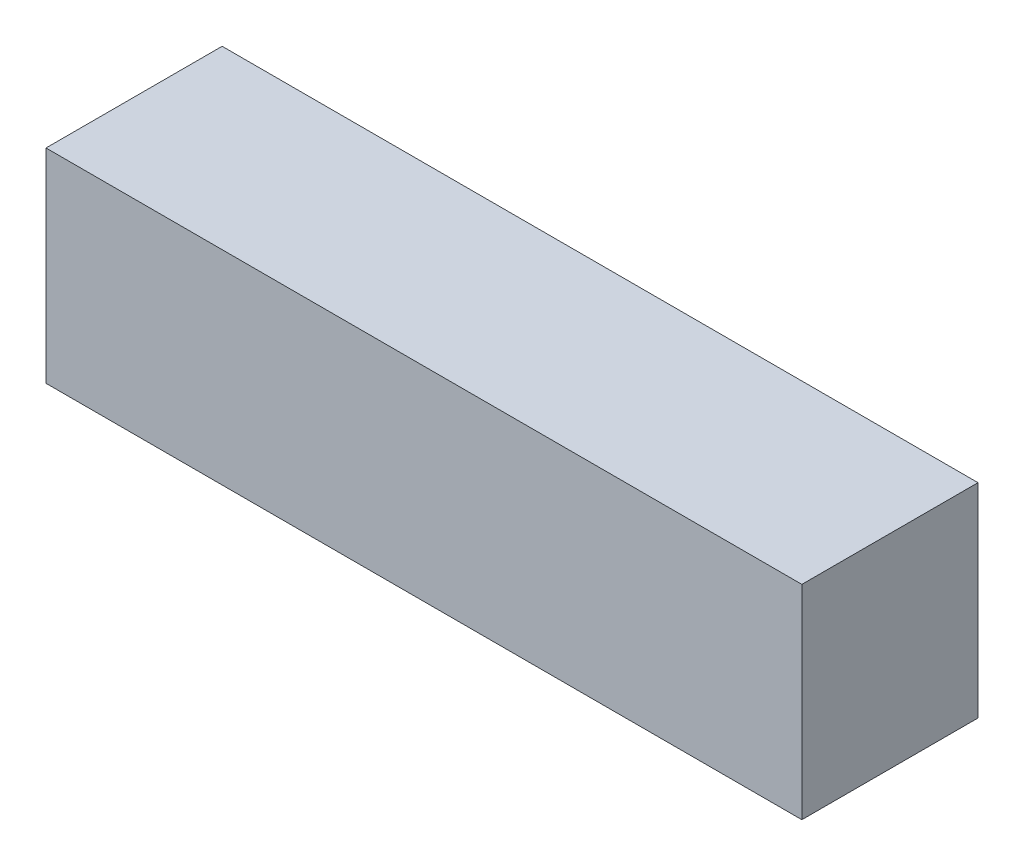
ISO-10303-21;
HEADER;
FILE_DESCRIPTION(('STEP AP214'),'2;1');
FILE_NAME('part.step','',(''),(''),'','','');
FILE_SCHEMA(('AUTOMOTIVE_DESIGN { 1 0 10303 214 1 1 1 1 }'));
ENDSEC;
DATA;
#1=APPLICATION_CONTEXT('core data for automotive mechanical design processes');
#2=APPLICATION_PROTOCOL_DEFINITION('international standard','automotive_design',2000,#1);
#3=PRODUCT_CONTEXT('',#1,'mechanical');
#4=PRODUCT('Part','Part','',(#3));
#5=PRODUCT_RELATED_PRODUCT_CATEGORY('part','',(#4));
#6=PRODUCT_DEFINITION_FORMATION('','',#4);
#7=PRODUCT_DEFINITION_CONTEXT('part definition',#1,'design');
#8=PRODUCT_DEFINITION('design','',#6,#7);
#9=PRODUCT_DEFINITION_SHAPE('','',#8);
#10=(LENGTH_UNIT() NAMED_UNIT(*) SI_UNIT(.MILLI.,.METRE.));
#11=(NAMED_UNIT(*) PLANE_ANGLE_UNIT() SI_UNIT($,.RADIAN.));
#12=(NAMED_UNIT(*) SI_UNIT($,.STERADIAN.) SOLID_ANGLE_UNIT());
#13=UNCERTAINTY_MEASURE_WITH_UNIT(LENGTH_MEASURE(1.E-05),#10,'distance_accuracy_value','');
#14=(GEOMETRIC_REPRESENTATION_CONTEXT(3) GLOBAL_UNCERTAINTY_ASSIGNED_CONTEXT((#13)) GLOBAL_UNIT_ASSIGNED_CONTEXT((#10,
#11,#12)) REPRESENTATION_CONTEXT('',''));
#15=CARTESIAN_POINT('',(0.,0.,0.));
#16=DIRECTION('',(0.,0.,1.));
#17=DIRECTION('',(1.,0.,0.));
#18=AXIS2_PLACEMENT_3D('',#15,#16,#17);
#19=CARTESIAN_POINT('',(0.,0.,24.2316));
#20=DIRECTION('',(1.,0.,0.));
#21=DIRECTION('',(0.,1.,0.));
#22=AXIS2_PLACEMENT_3D('',#19,#20,#21);
#23=PLANE('',#22);
#24=DIRECTION('',(0.,-1.,0.));
#25=VECTOR('',#24,1.);
#26=CARTESIAN_POINT('',(0.,0.,0.));
#27=LINE('',#26,#25);
#28=CARTESIAN_POINT('',(0.,28.0416,0.));
#29=VERTEX_POINT('',#28);
#30=CARTESIAN_POINT('',(0.,0.,0.));
#31=VERTEX_POINT('',#30);
#32=EDGE_CURVE('E96',#29,#31,#27,.T.);
#33=ORIENTED_EDGE('',*,*,#32,.T.);
#34=DIRECTION('',(0.,0.,-1.));
#35=VECTOR('',#34,1.);
#36=CARTESIAN_POINT('',(0.,0.,24.2316));
#37=LINE('',#36,#35);
#38=CARTESIAN_POINT('',(0.,0.,24.2316));
#39=VERTEX_POINT('',#38);
#40=EDGE_CURVE('E11',#39,#31,#37,.T.);
#41=ORIENTED_EDGE('',*,*,#40,.F.);
#42=DIRECTION('',(0.,-1.,0.));
#43=VECTOR('',#42,1.);
#44=CARTESIAN_POINT('',(0.,0.,24.2316));
#45=LINE('',#44,#43);
#46=CARTESIAN_POINT('',(0.,28.0416,24.2316));
#47=VERTEX_POINT('',#46);
#48=EDGE_CURVE('E84',#47,#39,#45,.T.);
#49=ORIENTED_EDGE('',*,*,#48,.F.);
#50=DIRECTION('',(0.,0.,-1.));
#51=VECTOR('',#50,1.);
#52=CARTESIAN_POINT('',(0.,28.0416,24.2316));
#53=LINE('',#52,#51);
#54=EDGE_CURVE('E92',#47,#29,#53,.T.);
#55=ORIENTED_EDGE('',*,*,#54,.T.);
#56=EDGE_LOOP('',(#33,#41,#49,#55));
#57=FACE_BOUND('',#56,.T.);
#58=ADVANCED_FACE('F33',(#57),#23,.F.);
#59=CARTESIAN_POINT('',(0.,0.,24.2316));
#60=DIRECTION('',(0.,1.,0.));
#61=DIRECTION('',(0.,0.,1.));
#62=AXIS2_PLACEMENT_3D('',#59,#60,#61);
#63=PLANE('',#62);
#64=DIRECTION('',(1.,0.,0.));
#65=VECTOR('',#64,1.);
#66=CARTESIAN_POINT('',(0.,0.,0.));
#67=LINE('',#66,#65);
#68=CARTESIAN_POINT('',(103.9876,0.,0.));
#69=VERTEX_POINT('',#68);
#70=EDGE_CURVE('E88',#31,#69,#67,.T.);
#71=ORIENTED_EDGE('',*,*,#70,.T.);
#72=DIRECTION('',(0.,0.,-1.));
#73=VECTOR('',#72,1.);
#74=CARTESIAN_POINT('',(103.9876,0.,24.2316));
#75=LINE('',#74,#73);
#76=CARTESIAN_POINT('',(103.9876,0.,24.2316));
#77=VERTEX_POINT('',#76);
#78=EDGE_CURVE('E41',#77,#69,#75,.T.);
#79=ORIENTED_EDGE('',*,*,#78,.F.);
#80=DIRECTION('',(1.,0.,0.));
#81=VECTOR('',#80,1.);
#82=CARTESIAN_POINT('',(0.,0.,24.2316));
#83=LINE('',#82,#81);
#84=EDGE_CURVE('E79',#39,#77,#83,.T.);
#85=ORIENTED_EDGE('',*,*,#84,.F.);
#86=ORIENTED_EDGE('',*,*,#40,.T.);
#87=EDGE_LOOP('',(#71,#79,#85,#86));
#88=FACE_BOUND('',#87,.T.);
#89=ADVANCED_FACE('F87',(#88),#63,.F.);
#90=CARTESIAN_POINT('',(103.9876,0.,24.2316));
#91=DIRECTION('',(-1.,0.,0.));
#92=DIRECTION('',(0.,-1.,0.));
#93=AXIS2_PLACEMENT_3D('',#90,#91,#92);
#94=PLANE('',#93);
#95=DIRECTION('',(0.,1.,0.));
#96=VECTOR('',#95,1.);
#97=CARTESIAN_POINT('',(103.9876,0.,0.));
#98=LINE('',#97,#96);
#99=CARTESIAN_POINT('',(103.9876,28.0416,0.));
#100=VERTEX_POINT('',#99);
#101=EDGE_CURVE('E66',#69,#100,#98,.T.);
#102=ORIENTED_EDGE('',*,*,#101,.T.);
#103=DIRECTION('',(0.,0.,-1.));
#104=VECTOR('',#103,1.);
#105=CARTESIAN_POINT('',(103.9876,28.0416,24.2316));
#106=LINE('',#105,#104);
#107=CARTESIAN_POINT('',(103.9876,28.0416,24.2316));
#108=VERTEX_POINT('',#107);
#109=EDGE_CURVE('E89',#108,#100,#106,.T.);
#110=ORIENTED_EDGE('',*,*,#109,.F.);
#111=DIRECTION('',(0.,1.,0.));
#112=VECTOR('',#111,1.);
#113=CARTESIAN_POINT('',(103.9876,0.,24.2316));
#114=LINE('',#113,#112);
#115=EDGE_CURVE('E82',#77,#108,#114,.T.);
#116=ORIENTED_EDGE('',*,*,#115,.F.);
#117=ORIENTED_EDGE('',*,*,#78,.T.);
#118=EDGE_LOOP('',(#102,#110,#116,#117));
#119=FACE_BOUND('',#118,.T.);
#120=ADVANCED_FACE('F90',(#119),#94,.F.);
#121=CARTESIAN_POINT('',(0.,28.0416,24.2316));
#122=DIRECTION('',(0.,-1.,0.));
#123=DIRECTION('',(0.,0.,-1.));
#124=AXIS2_PLACEMENT_3D('',#121,#122,#123);
#125=PLANE('',#124);
#126=DIRECTION('',(-1.,0.,0.));
#127=VECTOR('',#126,1.);
#128=CARTESIAN_POINT('',(0.,28.0416,0.));
#129=LINE('',#128,#127);
#130=EDGE_CURVE('E72',#100,#29,#129,.T.);
#131=ORIENTED_EDGE('',*,*,#130,.T.);
#132=ORIENTED_EDGE('',*,*,#54,.F.);
#133=DIRECTION('',(-1.,0.,0.));
#134=VECTOR('',#133,1.);
#135=CARTESIAN_POINT('',(0.,28.0416,24.2316));
#136=LINE('',#135,#134);
#137=EDGE_CURVE('E49',#108,#47,#136,.T.);
#138=ORIENTED_EDGE('',*,*,#137,.F.);
#139=ORIENTED_EDGE('',*,*,#109,.T.);
#140=EDGE_LOOP('',(#131,#132,#138,#139));
#141=FACE_BOUND('',#140,.T.);
#142=ADVANCED_FACE('F103',(#141),#125,.F.);
#143=CARTESIAN_POINT('',(0.,0.,24.2316));
#144=DIRECTION('',(0.,0.,-1.));
#145=DIRECTION('',(-1.,0.,0.));
#146=AXIS2_PLACEMENT_3D('',#143,#144,#145);
#147=PLANE('',#146);
#148=ORIENTED_EDGE('',*,*,#48,.T.);
#149=ORIENTED_EDGE('',*,*,#84,.T.);
#150=ORIENTED_EDGE('',*,*,#115,.T.);
#151=ORIENTED_EDGE('',*,*,#137,.T.);
#152=EDGE_LOOP('',(#148,#149,#150,#151));
#153=FACE_BOUND('',#152,.T.);
#154=ADVANCED_FACE('F80',(#153),#147,.F.);
#155=CARTESIAN_POINT('',(0.,0.,0.));
#156=DIRECTION('',(0.,0.,-1.));
#157=DIRECTION('',(-1.,0.,0.));
#158=AXIS2_PLACEMENT_3D('',#155,#156,#157);
#159=PLANE('',#158);
#160=ORIENTED_EDGE('',*,*,#32,.F.);
#161=ORIENTED_EDGE('',*,*,#130,.F.);
#162=ORIENTED_EDGE('',*,*,#101,.F.);
#163=ORIENTED_EDGE('',*,*,#70,.F.);
#164=EDGE_LOOP('',(#160,#161,#162,#163));
#165=FACE_BOUND('',#164,.T.);
#166=ADVANCED_FACE('F106',(#165),#159,.T.);
#167=CLOSED_SHELL('',(#58,#89,#120,#142,#154,#166));
#168=MANIFOLD_SOLID_BREP('B2',#167);
#169=ADVANCED_BREP_SHAPE_REPRESENTATION('',(#18,#168),#14);
#170=SHAPE_DEFINITION_REPRESENTATION(#9,#169);
ENDSEC;
END-ISO-10303-21;
